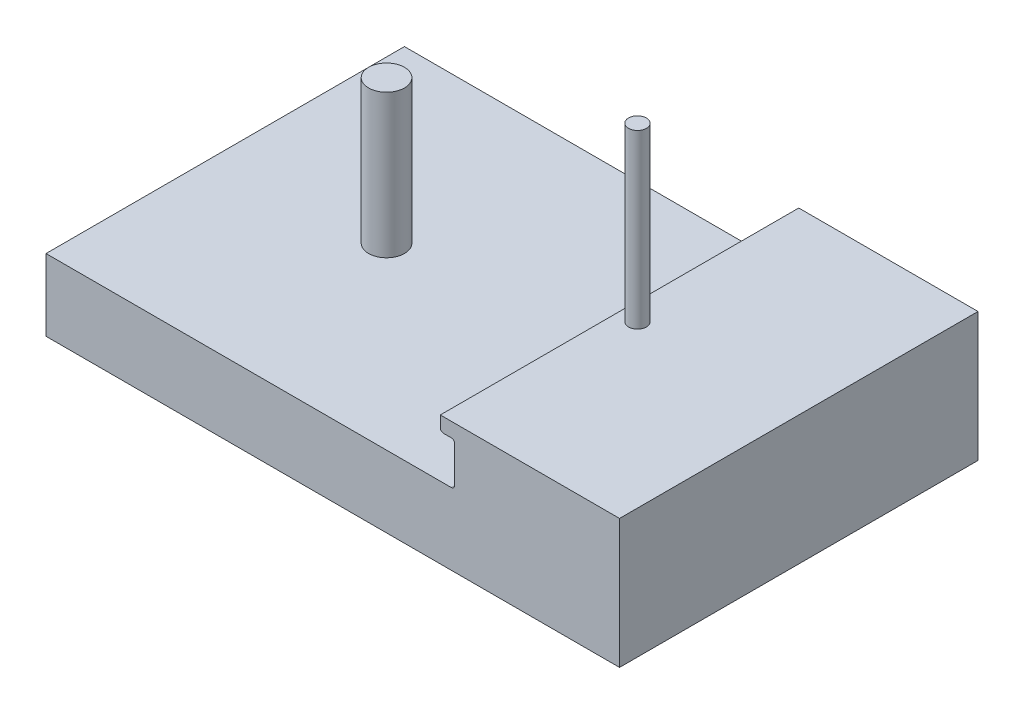
ISO-10303-21;
HEADER;
FILE_DESCRIPTION(('STEP AP214'),'2;1');
FILE_NAME('part.step','',(''),(''),'','','');
FILE_SCHEMA(('AUTOMOTIVE_DESIGN { 1 0 10303 214 1 1 1 1 }'));
ENDSEC;
DATA;
#1=APPLICATION_CONTEXT('core data for automotive mechanical design processes');
#2=APPLICATION_PROTOCOL_DEFINITION('international standard','automotive_design',2000,#1);
#3=PRODUCT_CONTEXT('',#1,'mechanical');
#4=PRODUCT('Part','Part','',(#3));
#5=PRODUCT_RELATED_PRODUCT_CATEGORY('part','',(#4));
#6=PRODUCT_DEFINITION_FORMATION('','',#4);
#7=PRODUCT_DEFINITION_CONTEXT('part definition',#1,'design');
#8=PRODUCT_DEFINITION('design','',#6,#7);
#9=PRODUCT_DEFINITION_SHAPE('','',#8);
#10=(LENGTH_UNIT() NAMED_UNIT(*) SI_UNIT(.MILLI.,.METRE.));
#11=(NAMED_UNIT(*) PLANE_ANGLE_UNIT() SI_UNIT($,.RADIAN.));
#12=(NAMED_UNIT(*) SI_UNIT($,.STERADIAN.) SOLID_ANGLE_UNIT());
#13=UNCERTAINTY_MEASURE_WITH_UNIT(LENGTH_MEASURE(1.E-05),#10,'distance_accuracy_value','');
#14=(GEOMETRIC_REPRESENTATION_CONTEXT(3) GLOBAL_UNCERTAINTY_ASSIGNED_CONTEXT((#13)) GLOBAL_UNIT_ASSIGNED_CONTEXT((#10,
#11,#12)) REPRESENTATION_CONTEXT('',''));
#15=CARTESIAN_POINT('',(0.,0.,0.));
#16=DIRECTION('',(0.,0.,1.));
#17=DIRECTION('',(1.,0.,0.));
#18=AXIS2_PLACEMENT_3D('',#15,#16,#17);
#19=CARTESIAN_POINT('',(0.,10.,0.));
#20=DIRECTION('',(0.,1.,0.));
#21=DIRECTION('',(0.,0.,1.));
#22=AXIS2_PLACEMENT_3D('',#19,#20,#21);
#23=PLANE('',#22);
#24=DIRECTION('',(1.,0.,0.));
#25=VECTOR('',#24,1.);
#26=CARTESIAN_POINT('',(-40.,10.,25.));
#27=LINE('',#26,#25);
#28=CARTESIAN_POINT('',(-40.,10.,25.));
#29=VERTEX_POINT('',#28);
#30=CARTESIAN_POINT('',(16.5260230190226,10.,25.));
#31=VERTEX_POINT('',#30);
#32=EDGE_CURVE('E110',#29,#31,#27,.T.);
#33=ORIENTED_EDGE('',*,*,#32,.T.);
#34=DIRECTION('',(0.,0.,-1.));
#35=VECTOR('',#34,1.);
#36=CARTESIAN_POINT('',(16.5260230190226,10.,25.));
#37=LINE('',#36,#35);
#38=CARTESIAN_POINT('',(16.5260230190226,10.,-25.));
#39=VERTEX_POINT('',#38);
#40=EDGE_CURVE('E188',#31,#39,#37,.T.);
#41=ORIENTED_EDGE('',*,*,#40,.T.);
#42=DIRECTION('',(-1.,0.,0.));
#43=VECTOR('',#42,1.);
#44=CARTESIAN_POINT('',(-40.,10.,-25.));
#45=LINE('',#44,#43);
#46=CARTESIAN_POINT('',(-40.,10.,-25.));
#47=VERTEX_POINT('',#46);
#48=EDGE_CURVE('E99',#39,#47,#45,.T.);
#49=ORIENTED_EDGE('',*,*,#48,.T.);
#50=DIRECTION('',(0.,0.,1.));
#51=VECTOR('',#50,1.);
#52=CARTESIAN_POINT('',(-40.,10.,-25.));
#53=LINE('',#52,#51);
#54=EDGE_CURVE('E66',#47,#29,#53,.T.);
#55=ORIENTED_EDGE('',*,*,#54,.T.);
#56=EDGE_LOOP('',(#33,#41,#49,#55));
#57=FACE_BOUND('',#56,.T.);
#58=CARTESIAN_POINT('',(-17.5,10.,0.));
#59=DIRECTION('',(0.,1.,0.));
#60=DIRECTION('',(0.,0.,1.));
#61=AXIS2_PLACEMENT_3D('',#58,#59,#60);
#62=CIRCLE('',#61,2.5);
#63=CARTESIAN_POINT('',(-17.5,10.,2.5));
#64=VERTEX_POINT('',#63);
#65=EDGE_CURVE('E122',#64,#64,#62,.T.);
#66=ORIENTED_EDGE('',*,*,#65,.F.);
#67=EDGE_LOOP('',(#66));
#68=FACE_BOUND('',#67,.T.);
#69=ADVANCED_FACE('F41',(#57,#68),#23,.T.);
#70=CARTESIAN_POINT('',(40.,10.,-25.));
#71=DIRECTION('',(-1.,0.,0.));
#72=DIRECTION('',(0.,0.,1.));
#73=AXIS2_PLACEMENT_3D('',#70,#71,#72);
#74=PLANE('',#73);
#75=DIRECTION('',(0.,0.,-1.));
#76=VECTOR('',#75,1.);
#77=CARTESIAN_POINT('',(40.,0.,-25.));
#78=LINE('',#77,#76);
#79=CARTESIAN_POINT('',(40.,0.,25.));
#80=VERTEX_POINT('',#79);
#81=CARTESIAN_POINT('',(40.,0.,-25.));
#82=VERTEX_POINT('',#81);
#83=EDGE_CURVE('E106',#80,#82,#78,.T.);
#84=ORIENTED_EDGE('',*,*,#83,.T.);
#85=DIRECTION('',(0.,-1.,0.));
#86=VECTOR('',#85,1.);
#87=CARTESIAN_POINT('',(40.,10.,-25.));
#88=LINE('',#87,#86);
#89=CARTESIAN_POINT('',(40.,18.,-25.));
#90=VERTEX_POINT('',#89);
#91=EDGE_CURVE('E50',#90,#82,#88,.T.);
#92=ORIENTED_EDGE('',*,*,#91,.F.);
#93=DIRECTION('',(0.,0.,-1.));
#94=VECTOR('',#93,1.);
#95=CARTESIAN_POINT('',(40.,18.,-25.));
#96=LINE('',#95,#94);
#97=CARTESIAN_POINT('',(40.,18.,25.));
#98=VERTEX_POINT('',#97);
#99=EDGE_CURVE('E108',#98,#90,#96,.T.);
#100=ORIENTED_EDGE('',*,*,#99,.F.);
#101=DIRECTION('',(0.,-1.,0.));
#102=VECTOR('',#101,1.);
#103=CARTESIAN_POINT('',(40.,10.,25.));
#104=LINE('',#103,#102);
#105=EDGE_CURVE('E91',#98,#80,#104,.T.);
#106=ORIENTED_EDGE('',*,*,#105,.T.);
#107=EDGE_LOOP('',(#84,#92,#100,#106));
#108=FACE_BOUND('',#107,.T.);
#109=ADVANCED_FACE('F43',(#108),#74,.F.);
#110=CARTESIAN_POINT('',(-40.,10.,-25.));
#111=DIRECTION('',(0.,0.,1.));
#112=DIRECTION('',(1.,0.,0.));
#113=AXIS2_PLACEMENT_3D('',#110,#111,#112);
#114=PLANE('',#113);
#115=ORIENTED_EDGE('',*,*,#48,.F.);
#116=CARTESIAN_POINT('',(16.5260230190226,10.4739769809774,-25.));
#117=DIRECTION('',(0.,0.,-1.));
#118=DIRECTION('',(1.,0.,0.));
#119=AXIS2_PLACEMENT_3D('',#116,#117,#118);
#120=CIRCLE('',#119,0.473976980977433);
#121=CARTESIAN_POINT('',(17.,10.4739769809774,-25.));
#122=VERTEX_POINT('',#121);
#123=EDGE_CURVE('E197',#122,#39,#120,.T.);
#124=ORIENTED_EDGE('',*,*,#123,.F.);
#125=DIRECTION('',(0.,-1.,0.));
#126=VECTOR('',#125,1.);
#127=CARTESIAN_POINT('',(17.,15.5260230190226,-25.));
#128=LINE('',#127,#126);
#129=CARTESIAN_POINT('',(17.,15.5260230190226,-25.));
#130=VERTEX_POINT('',#129);
#131=EDGE_CURVE('E227',#130,#122,#128,.T.);
#132=ORIENTED_EDGE('',*,*,#131,.F.);
#133=CARTESIAN_POINT('',(16.5260230190226,15.5260230190226,-25.));
#134=DIRECTION('',(0.,0.,-1.));
#135=DIRECTION('',(1.,0.,0.));
#136=AXIS2_PLACEMENT_3D('',#133,#134,#135);
#137=CIRCLE('',#136,0.473976980977433);
#138=CARTESIAN_POINT('',(16.5260230190226,16.,-25.));
#139=VERTEX_POINT('',#138);
#140=EDGE_CURVE('E223',#139,#130,#137,.T.);
#141=ORIENTED_EDGE('',*,*,#140,.F.);
#142=DIRECTION('',(1.,0.,0.));
#143=VECTOR('',#142,1.);
#144=CARTESIAN_POINT('',(15.4739769809774,16.,-25.));
#145=LINE('',#144,#143);
#146=CARTESIAN_POINT('',(15.4739769809774,16.,-25.));
#147=VERTEX_POINT('',#146);
#148=EDGE_CURVE('E219',#147,#139,#145,.T.);
#149=ORIENTED_EDGE('',*,*,#148,.F.);
#150=CARTESIAN_POINT('',(15.4739769809774,16.4739769809774,-25.));
#151=DIRECTION('',(0.,0.,1.));
#152=DIRECTION('',(-1.,0.,0.));
#153=AXIS2_PLACEMENT_3D('',#150,#151,#152);
#154=CIRCLE('',#153,0.473976980977433);
#155=CARTESIAN_POINT('',(15.,16.4739769809774,-25.));
#156=VERTEX_POINT('',#155);
#157=EDGE_CURVE('E215',#156,#147,#154,.T.);
#158=ORIENTED_EDGE('',*,*,#157,.F.);
#159=DIRECTION('',(0.,-1.,0.));
#160=VECTOR('',#159,1.);
#161=CARTESIAN_POINT('',(15.,18.,-25.));
#162=LINE('',#161,#160);
#163=CARTESIAN_POINT('',(15.,18.,-25.));
#164=VERTEX_POINT('',#163);
#165=EDGE_CURVE('E171',#164,#156,#162,.T.);
#166=ORIENTED_EDGE('',*,*,#165,.F.);
#167=DIRECTION('',(-1.,0.,0.));
#168=VECTOR('',#167,1.);
#169=CARTESIAN_POINT('',(40.,18.,-25.));
#170=LINE('',#169,#168);
#171=EDGE_CURVE('E143',#90,#164,#170,.T.);
#172=ORIENTED_EDGE('',*,*,#171,.F.);
#173=ORIENTED_EDGE('',*,*,#91,.T.);
#174=DIRECTION('',(-1.,0.,0.));
#175=VECTOR('',#174,1.);
#176=CARTESIAN_POINT('',(-40.,0.,-25.));
#177=LINE('',#176,#175);
#178=CARTESIAN_POINT('',(-40.,0.,-25.));
#179=VERTEX_POINT('',#178);
#180=EDGE_CURVE('E113',#82,#179,#177,.T.);
#181=ORIENTED_EDGE('',*,*,#180,.T.);
#182=DIRECTION('',(0.,-1.,0.));
#183=VECTOR('',#182,1.);
#184=CARTESIAN_POINT('',(-40.,10.,-25.));
#185=LINE('',#184,#183);
#186=EDGE_CURVE('E131',#47,#179,#185,.T.);
#187=ORIENTED_EDGE('',*,*,#186,.F.);
#188=EDGE_LOOP('',(#115,#124,#132,#141,#149,#158,#166,#172,#173,#181,#187));
#189=FACE_BOUND('',#188,.T.);
#190=ADVANCED_FACE('F138',(#189),#114,.F.);
#191=CARTESIAN_POINT('',(-40.,10.,-25.));
#192=DIRECTION('',(1.,0.,0.));
#193=DIRECTION('',(0.,0.,-1.));
#194=AXIS2_PLACEMENT_3D('',#191,#192,#193);
#195=PLANE('',#194);
#196=DIRECTION('',(0.,0.,1.));
#197=VECTOR('',#196,1.);
#198=CARTESIAN_POINT('',(-40.,0.,-25.));
#199=LINE('',#198,#197);
#200=CARTESIAN_POINT('',(-40.,0.,25.));
#201=VERTEX_POINT('',#200);
#202=EDGE_CURVE('E100',#179,#201,#199,.T.);
#203=ORIENTED_EDGE('',*,*,#202,.T.);
#204=DIRECTION('',(0.,-1.,0.));
#205=VECTOR('',#204,1.);
#206=CARTESIAN_POINT('',(-40.,10.,25.));
#207=LINE('',#206,#205);
#208=EDGE_CURVE('E94',#29,#201,#207,.T.);
#209=ORIENTED_EDGE('',*,*,#208,.F.);
#210=ORIENTED_EDGE('',*,*,#54,.F.);
#211=ORIENTED_EDGE('',*,*,#186,.T.);
#212=EDGE_LOOP('',(#203,#209,#210,#211));
#213=FACE_BOUND('',#212,.T.);
#214=ADVANCED_FACE('F281',(#213),#195,.F.);
#215=CARTESIAN_POINT('',(-40.,10.,25.));
#216=DIRECTION('',(0.,0.,-1.));
#217=DIRECTION('',(-1.,0.,0.));
#218=AXIS2_PLACEMENT_3D('',#215,#216,#217);
#219=PLANE('',#218);
#220=CARTESIAN_POINT('',(16.5260230190226,10.4739769809774,25.));
#221=DIRECTION('',(0.,0.,-1.));
#222=DIRECTION('',(1.,0.,0.));
#223=AXIS2_PLACEMENT_3D('',#220,#221,#222);
#224=CIRCLE('',#223,0.473976980977433);
#225=CARTESIAN_POINT('',(17.,10.4739769809774,25.));
#226=VERTEX_POINT('',#225);
#227=EDGE_CURVE('E194',#226,#31,#224,.T.);
#228=ORIENTED_EDGE('',*,*,#227,.T.);
#229=ORIENTED_EDGE('',*,*,#32,.F.);
#230=ORIENTED_EDGE('',*,*,#208,.T.);
#231=DIRECTION('',(1.,0.,0.));
#232=VECTOR('',#231,1.);
#233=CARTESIAN_POINT('',(-40.,0.,25.));
#234=LINE('',#233,#232);
#235=EDGE_CURVE('E86',#201,#80,#234,.T.);
#236=ORIENTED_EDGE('',*,*,#235,.T.);
#237=ORIENTED_EDGE('',*,*,#105,.F.);
#238=DIRECTION('',(1.,0.,0.));
#239=VECTOR('',#238,1.);
#240=CARTESIAN_POINT('',(40.,18.,25.));
#241=LINE('',#240,#239);
#242=CARTESIAN_POINT('',(15.,18.,25.));
#243=VERTEX_POINT('',#242);
#244=EDGE_CURVE('E161',#243,#98,#241,.T.);
#245=ORIENTED_EDGE('',*,*,#244,.F.);
#246=DIRECTION('',(0.,-1.,0.));
#247=VECTOR('',#246,1.);
#248=CARTESIAN_POINT('',(15.,18.,25.));
#249=LINE('',#248,#247);
#250=CARTESIAN_POINT('',(15.,16.4739769809774,25.));
#251=VERTEX_POINT('',#250);
#252=EDGE_CURVE('E167',#243,#251,#249,.T.);
#253=ORIENTED_EDGE('',*,*,#252,.T.);
#254=CARTESIAN_POINT('',(15.4739769809774,16.4739769809774,25.));
#255=DIRECTION('',(0.,0.,1.));
#256=DIRECTION('',(-1.,0.,0.));
#257=AXIS2_PLACEMENT_3D('',#254,#255,#256);
#258=CIRCLE('',#257,0.473976980977433);
#259=CARTESIAN_POINT('',(15.4739769809774,16.,25.));
#260=VERTEX_POINT('',#259);
#261=EDGE_CURVE('E57',#251,#260,#258,.T.);
#262=ORIENTED_EDGE('',*,*,#261,.T.);
#263=DIRECTION('',(1.,0.,0.));
#264=VECTOR('',#263,1.);
#265=CARTESIAN_POINT('',(15.4739769809774,16.,25.));
#266=LINE('',#265,#264);
#267=CARTESIAN_POINT('',(16.5260230190226,16.,25.));
#268=VERTEX_POINT('',#267);
#269=EDGE_CURVE('E422',#260,#268,#266,.T.);
#270=ORIENTED_EDGE('',*,*,#269,.T.);
#271=CARTESIAN_POINT('',(16.5260230190226,15.5260230190226,25.));
#272=DIRECTION('',(0.,0.,-1.));
#273=DIRECTION('',(1.,0.,0.));
#274=AXIS2_PLACEMENT_3D('',#271,#272,#273);
#275=CIRCLE('',#274,0.473976980977433);
#276=CARTESIAN_POINT('',(17.,15.5260230190226,25.));
#277=VERTEX_POINT('',#276);
#278=EDGE_CURVE('E211',#268,#277,#275,.T.);
#279=ORIENTED_EDGE('',*,*,#278,.T.);
#280=DIRECTION('',(0.,-1.,0.));
#281=VECTOR('',#280,1.);
#282=CARTESIAN_POINT('',(17.,15.5260230190226,25.));
#283=LINE('',#282,#281);
#284=EDGE_CURVE('E204',#277,#226,#283,.T.);
#285=ORIENTED_EDGE('',*,*,#284,.T.);
#286=EDGE_LOOP('',(#228,#229,#230,#236,#237,#245,#253,#262,#270,#279,#285));
#287=FACE_BOUND('',#286,.T.);
#288=ADVANCED_FACE('F89',(#287),#219,.F.);
#289=CARTESIAN_POINT('',(0.,0.,0.));
#290=DIRECTION('',(0.,1.,0.));
#291=DIRECTION('',(0.,0.,1.));
#292=AXIS2_PLACEMENT_3D('',#289,#290,#291);
#293=PLANE('',#292);
#294=ORIENTED_EDGE('',*,*,#83,.F.);
#295=ORIENTED_EDGE('',*,*,#235,.F.);
#296=ORIENTED_EDGE('',*,*,#202,.F.);
#297=ORIENTED_EDGE('',*,*,#180,.F.);
#298=EDGE_LOOP('',(#294,#295,#296,#297));
#299=FACE_BOUND('',#298,.T.);
#300=ADVANCED_FACE('F112',(#299),#293,.F.);
#301=CARTESIAN_POINT('',(-17.5,30.,0.));
#302=DIRECTION('',(0.,-1.,0.));
#303=DIRECTION('',(0.,0.,-1.));
#304=AXIS2_PLACEMENT_3D('',#301,#302,#303);
#305=CYLINDRICAL_SURFACE('',#304,2.5);
#306=CARTESIAN_POINT('',(-17.5,30.,0.));
#307=DIRECTION('',(0.,1.,0.));
#308=DIRECTION('',(0.,0.,1.));
#309=AXIS2_PLACEMENT_3D('',#306,#307,#308);
#310=CIRCLE('',#309,2.5);
#311=CARTESIAN_POINT('',(-17.5,30.,2.5));
#312=VERTEX_POINT('',#311);
#313=EDGE_CURVE('E116',#312,#312,#310,.T.);
#314=ORIENTED_EDGE('',*,*,#313,.F.);
#315=EDGE_LOOP('',(#314));
#316=FACE_BOUND('',#315,.T.);
#317=ORIENTED_EDGE('',*,*,#65,.T.);
#318=EDGE_LOOP('',(#317));
#319=FACE_BOUND('',#318,.T.);
#320=ADVANCED_FACE('F276',(#316,#319),#305,.T.);
#321=CARTESIAN_POINT('',(-17.5,30.,0.));
#322=DIRECTION('',(0.,1.,0.));
#323=DIRECTION('',(0.,0.,1.));
#324=AXIS2_PLACEMENT_3D('',#321,#322,#323);
#325=PLANE('',#324);
#326=ORIENTED_EDGE('',*,*,#313,.T.);
#327=EDGE_LOOP('',(#326));
#328=FACE_BOUND('',#327,.T.);
#329=ADVANCED_FACE('F308',(#328),#325,.T.);
#330=CARTESIAN_POINT('',(15.,18.,-25.));
#331=DIRECTION('',(1.,0.,0.));
#332=DIRECTION('',(0.,0.,-1.));
#333=AXIS2_PLACEMENT_3D('',#330,#331,#332);
#334=PLANE('',#333);
#335=ORIENTED_EDGE('',*,*,#165,.T.);
#336=DIRECTION('',(0.,0.,-1.));
#337=VECTOR('',#336,1.);
#338=CARTESIAN_POINT('',(15.,16.4739769809774,25.));
#339=LINE('',#338,#337);
#340=EDGE_CURVE('E169',#251,#156,#339,.T.);
#341=ORIENTED_EDGE('',*,*,#340,.F.);
#342=ORIENTED_EDGE('',*,*,#252,.F.);
#343=DIRECTION('',(0.,0.,1.));
#344=VECTOR('',#343,1.);
#345=CARTESIAN_POINT('',(15.,18.,-25.));
#346=LINE('',#345,#344);
#347=EDGE_CURVE('E158',#164,#243,#346,.T.);
#348=ORIENTED_EDGE('',*,*,#347,.F.);
#349=EDGE_LOOP('',(#335,#341,#342,#348));
#350=FACE_BOUND('',#349,.T.);
#351=ADVANCED_FACE('F168',(#350),#334,.F.);
#352=CARTESIAN_POINT('',(0.,18.,0.));
#353=DIRECTION('',(0.,-1.,0.));
#354=DIRECTION('',(0.,0.,-1.));
#355=AXIS2_PLACEMENT_3D('',#352,#353,#354);
#356=PLANE('',#355);
#357=CARTESIAN_POINT('',(17.5,18.,0.));
#358=DIRECTION('',(0.,-1.,0.));
#359=DIRECTION('',(0.,0.,-1.));
#360=AXIS2_PLACEMENT_3D('',#357,#358,#359);
#361=CIRCLE('',#360,1.25);
#362=CARTESIAN_POINT('',(17.5,18.,-1.25));
#363=VERTEX_POINT('',#362);
#364=EDGE_CURVE('E11',#363,#363,#361,.T.);
#365=ORIENTED_EDGE('',*,*,#364,.T.);
#366=EDGE_LOOP('',(#365));
#367=FACE_BOUND('',#366,.T.);
#368=ORIENTED_EDGE('',*,*,#99,.T.);
#369=ORIENTED_EDGE('',*,*,#171,.T.);
#370=ORIENTED_EDGE('',*,*,#347,.T.);
#371=ORIENTED_EDGE('',*,*,#244,.T.);
#372=EDGE_LOOP('',(#368,#369,#370,#371));
#373=FACE_BOUND('',#372,.T.);
#374=ADVANCED_FACE('F160',(#367,#373),#356,.F.);
#375=CARTESIAN_POINT('',(17.5,30.,0.));
#376=DIRECTION('',(0.,-1.,0.));
#377=DIRECTION('',(0.,0.,-1.));
#378=AXIS2_PLACEMENT_3D('',#375,#376,#377);
#379=CYLINDRICAL_SURFACE('',#378,1.25);
#380=ORIENTED_EDGE('',*,*,#364,.F.);
#381=EDGE_LOOP('',(#380));
#382=FACE_BOUND('',#381,.T.);
#383=CARTESIAN_POINT('',(17.5,42.,0.));
#384=DIRECTION('',(0.,1.,0.));
#385=DIRECTION('',(0.,0.,1.));
#386=AXIS2_PLACEMENT_3D('',#383,#384,#385);
#387=CIRCLE('',#386,1.25);
#388=CARTESIAN_POINT('',(17.5,42.,1.25));
#389=VERTEX_POINT('',#388);
#390=EDGE_CURVE('E199',#389,#389,#387,.T.);
#391=ORIENTED_EDGE('',*,*,#390,.F.);
#392=EDGE_LOOP('',(#391));
#393=FACE_BOUND('',#392,.T.);
#394=ADVANCED_FACE('F255',(#382,#393),#379,.T.);
#395=CARTESIAN_POINT('',(17.5,42.,0.));
#396=DIRECTION('',(0.,1.,0.));
#397=DIRECTION('',(0.,0.,1.));
#398=AXIS2_PLACEMENT_3D('',#395,#396,#397);
#399=PLANE('',#398);
#400=ORIENTED_EDGE('',*,*,#390,.T.);
#401=EDGE_LOOP('',(#400));
#402=FACE_BOUND('',#401,.T.);
#403=ADVANCED_FACE('F253',(#402),#399,.T.);
#404=CARTESIAN_POINT('',(16.5260230190226,10.4739769809774,25.));
#405=DIRECTION('',(0.,0.,-1.));
#406=DIRECTION('',(-1.,0.,0.));
#407=AXIS2_PLACEMENT_3D('',#404,#405,#406);
#408=CYLINDRICAL_SURFACE('',#407,0.473976980977433);
#409=ORIENTED_EDGE('',*,*,#123,.T.);
#410=ORIENTED_EDGE('',*,*,#40,.F.);
#411=ORIENTED_EDGE('',*,*,#227,.F.);
#412=DIRECTION('',(0.,0.,-1.));
#413=VECTOR('',#412,1.);
#414=CARTESIAN_POINT('',(17.,10.4739769809774,25.));
#415=LINE('',#414,#413);
#416=EDGE_CURVE('E200',#226,#122,#415,.T.);
#417=ORIENTED_EDGE('',*,*,#416,.T.);
#418=EDGE_LOOP('',(#409,#410,#411,#417));
#419=FACE_BOUND('',#418,.T.);
#420=ADVANCED_FACE('F192',(#419),#408,.F.);
#421=CARTESIAN_POINT('',(17.,15.5260230190226,25.));
#422=DIRECTION('',(1.,0.,0.));
#423=DIRECTION('',(0.,0.,-1.));
#424=AXIS2_PLACEMENT_3D('',#421,#422,#423);
#425=PLANE('',#424);
#426=ORIENTED_EDGE('',*,*,#131,.T.);
#427=ORIENTED_EDGE('',*,*,#416,.F.);
#428=ORIENTED_EDGE('',*,*,#284,.F.);
#429=DIRECTION('',(0.,0.,-1.));
#430=VECTOR('',#429,1.);
#431=CARTESIAN_POINT('',(17.,15.5260230190226,25.));
#432=LINE('',#431,#430);
#433=EDGE_CURVE('E235',#277,#130,#432,.T.);
#434=ORIENTED_EDGE('',*,*,#433,.T.);
#435=EDGE_LOOP('',(#426,#427,#428,#434));
#436=FACE_BOUND('',#435,.T.);
#437=ADVANCED_FACE('F354',(#436),#425,.F.);
#438=CARTESIAN_POINT('',(16.5260230190226,15.5260230190226,25.));
#439=DIRECTION('',(0.,0.,-1.));
#440=DIRECTION('',(-1.,0.,0.));
#441=AXIS2_PLACEMENT_3D('',#438,#439,#440);
#442=CYLINDRICAL_SURFACE('',#441,0.473976980977433);
#443=ORIENTED_EDGE('',*,*,#140,.T.);
#444=ORIENTED_EDGE('',*,*,#433,.F.);
#445=ORIENTED_EDGE('',*,*,#278,.F.);
#446=DIRECTION('',(0.,0.,-1.));
#447=VECTOR('',#446,1.);
#448=CARTESIAN_POINT('',(16.5260230190226,16.,25.));
#449=LINE('',#448,#447);
#450=EDGE_CURVE('E239',#268,#139,#449,.T.);
#451=ORIENTED_EDGE('',*,*,#450,.T.);
#452=EDGE_LOOP('',(#443,#444,#445,#451));
#453=FACE_BOUND('',#452,.T.);
#454=ADVANCED_FACE('F362',(#453),#442,.F.);
#455=CARTESIAN_POINT('',(15.4739769809774,16.,25.));
#456=DIRECTION('',(0.,1.,0.));
#457=DIRECTION('',(0.,0.,1.));
#458=AXIS2_PLACEMENT_3D('',#455,#456,#457);
#459=PLANE('',#458);
#460=ORIENTED_EDGE('',*,*,#148,.T.);
#461=ORIENTED_EDGE('',*,*,#450,.F.);
#462=ORIENTED_EDGE('',*,*,#269,.F.);
#463=DIRECTION('',(0.,0.,-1.));
#464=VECTOR('',#463,1.);
#465=CARTESIAN_POINT('',(15.4739769809774,16.,25.));
#466=LINE('',#465,#464);
#467=EDGE_CURVE('E209',#260,#147,#466,.T.);
#468=ORIENTED_EDGE('',*,*,#467,.T.);
#469=EDGE_LOOP('',(#460,#461,#462,#468));
#470=FACE_BOUND('',#469,.T.);
#471=ADVANCED_FACE('F371',(#470),#459,.F.);
#472=CARTESIAN_POINT('',(15.4739769809774,16.4739769809774,25.));
#473=DIRECTION('',(0.,0.,-1.));
#474=DIRECTION('',(-1.,0.,0.));
#475=AXIS2_PLACEMENT_3D('',#472,#473,#474);
#476=CYLINDRICAL_SURFACE('',#475,0.473976980977433);
#477=ORIENTED_EDGE('',*,*,#157,.T.);
#478=ORIENTED_EDGE('',*,*,#467,.F.);
#479=ORIENTED_EDGE('',*,*,#261,.F.);
#480=ORIENTED_EDGE('',*,*,#340,.T.);
#481=EDGE_LOOP('',(#477,#478,#479,#480));
#482=FACE_BOUND('',#481,.T.);
#483=ADVANCED_FACE('F380',(#482),#476,.T.);
#484=CLOSED_SHELL('',(#69,#109,#190,#214,#288,#300,#320,#329,#351,#374,#394,#403,#420,#437,#454,
#471,#483));
#485=MANIFOLD_SOLID_BREP('B2',#484);
#486=ADVANCED_BREP_SHAPE_REPRESENTATION('',(#18,#485),#14);
#487=SHAPE_DEFINITION_REPRESENTATION(#9,#486);
ENDSEC;
END-ISO-10303-21;
